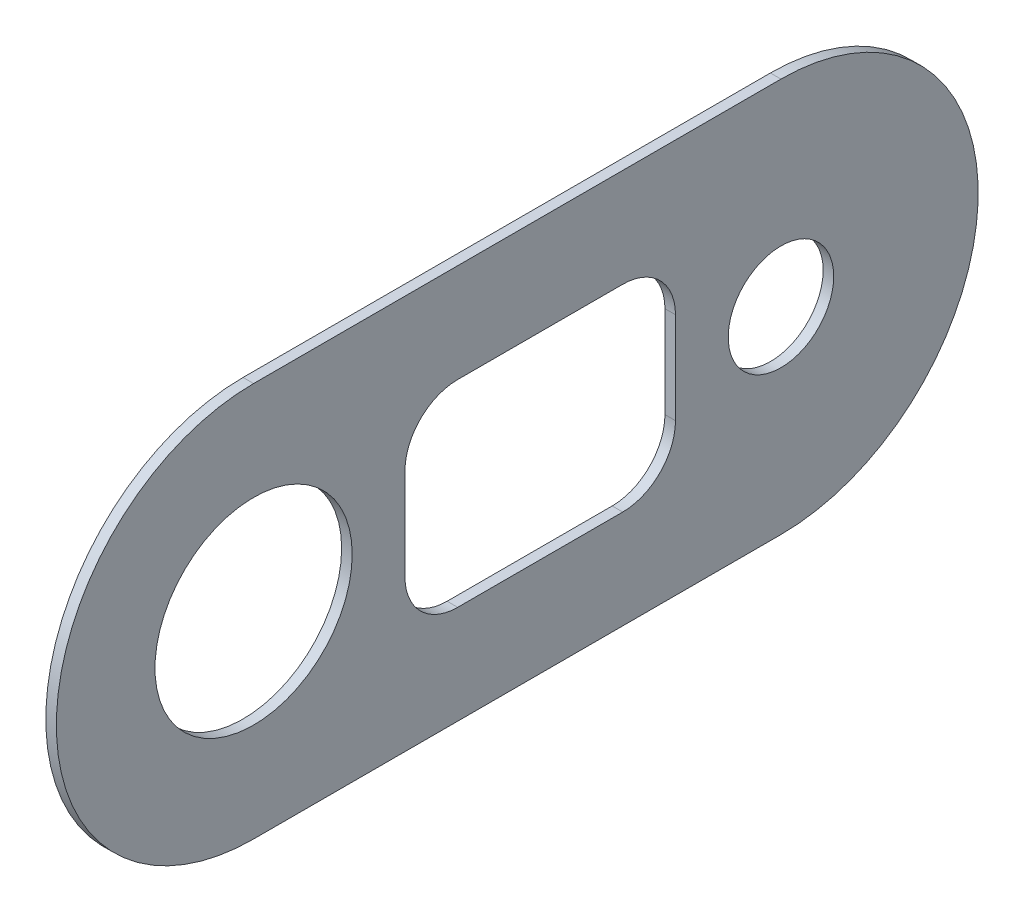
ISO-10303-21;
HEADER;
FILE_DESCRIPTION(('STEP AP214'),'2;1');
FILE_NAME('part.step','',(''),(''),'','','');
FILE_SCHEMA(('AUTOMOTIVE_DESIGN { 1 0 10303 214 1 1 1 1 }'));
ENDSEC;
DATA;
#1=APPLICATION_CONTEXT('core data for automotive mechanical design processes');
#2=APPLICATION_PROTOCOL_DEFINITION('international standard','automotive_design',2000,#1);
#3=PRODUCT_CONTEXT('',#1,'mechanical');
#4=PRODUCT('Part','Part','',(#3));
#5=PRODUCT_RELATED_PRODUCT_CATEGORY('part','',(#4));
#6=PRODUCT_DEFINITION_FORMATION('','',#4);
#7=PRODUCT_DEFINITION_CONTEXT('part definition',#1,'design');
#8=PRODUCT_DEFINITION('design','',#6,#7);
#9=PRODUCT_DEFINITION_SHAPE('','',#8);
#10=(LENGTH_UNIT() NAMED_UNIT(*) SI_UNIT(.MILLI.,.METRE.));
#11=(NAMED_UNIT(*) PLANE_ANGLE_UNIT() SI_UNIT($,.RADIAN.));
#12=(NAMED_UNIT(*) SI_UNIT($,.STERADIAN.) SOLID_ANGLE_UNIT());
#13=UNCERTAINTY_MEASURE_WITH_UNIT(LENGTH_MEASURE(1.E-05),#10,'distance_accuracy_value','');
#14=(GEOMETRIC_REPRESENTATION_CONTEXT(3) GLOBAL_UNCERTAINTY_ASSIGNED_CONTEXT((#13)) GLOBAL_UNIT_ASSIGNED_CONTEXT((#10,
#11,#12)) REPRESENTATION_CONTEXT('',''));
#15=CARTESIAN_POINT('',(0.,0.,0.));
#16=DIRECTION('',(0.,0.,1.));
#17=DIRECTION('',(1.,0.,0.));
#18=AXIS2_PLACEMENT_3D('',#15,#16,#17);
#19=CARTESIAN_POINT('',(2.54,47.498,0.));
#20=DIRECTION('',(1.,0.,0.));
#21=DIRECTION('',(0.,0.,-1.));
#22=AXIS2_PLACEMENT_3D('',#19,#20,#21);
#23=PLANE('',#22);
#24=CARTESIAN_POINT('',(2.54,47.498,0.));
#25=DIRECTION('',(1.,0.,0.));
#26=DIRECTION('',(0.,0.,-1.));
#27=AXIS2_PLACEMENT_3D('',#24,#25,#26);
#28=CIRCLE('',#27,12.7);
#29=CARTESIAN_POINT('',(2.54,47.498,-12.7));
#30=VERTEX_POINT('',#29);
#31=EDGE_CURVE('E202',#30,#30,#28,.T.);
#32=ORIENTED_EDGE('',*,*,#31,.F.);
#33=EDGE_LOOP('',(#32));
#34=FACE_BOUND('',#33,.T.);
#35=CARTESIAN_POINT('',(2.54,47.498,0.));
#36=DIRECTION('',(1.,0.,0.));
#37=DIRECTION('',(0.,0.,-1.));
#38=AXIS2_PLACEMENT_3D('',#35,#36,#37);
#39=CIRCLE('',#38,47.498);
#40=CARTESIAN_POINT('',(2.54,0.,0.));
#41=VERTEX_POINT('',#40);
#42=CARTESIAN_POINT('',(2.54,94.996,0.));
#43=VERTEX_POINT('',#42);
#44=EDGE_CURVE('E211',#41,#43,#39,.T.);
#45=ORIENTED_EDGE('',*,*,#44,.T.);
#46=DIRECTION('',(0.,0.,1.));
#47=VECTOR('',#46,1.);
#48=CARTESIAN_POINT('',(2.54,94.996,0.));
#49=LINE('',#48,#47);
#50=CARTESIAN_POINT('',(2.54,94.996,127.));
#51=VERTEX_POINT('',#50);
#52=EDGE_CURVE('E212',#43,#51,#49,.T.);
#53=ORIENTED_EDGE('',*,*,#52,.T.);
#54=CARTESIAN_POINT('',(2.54,47.498,127.));
#55=DIRECTION('',(1.,0.,0.));
#56=DIRECTION('',(0.,0.,1.));
#57=AXIS2_PLACEMENT_3D('',#54,#55,#56);
#58=CIRCLE('',#57,47.498);
#59=CARTESIAN_POINT('',(2.54,0.,127.));
#60=VERTEX_POINT('',#59);
#61=EDGE_CURVE('E220',#51,#60,#58,.T.);
#62=ORIENTED_EDGE('',*,*,#61,.T.);
#63=DIRECTION('',(0.,0.,-1.));
#64=VECTOR('',#63,1.);
#65=CARTESIAN_POINT('',(2.54,0.,0.));
#66=LINE('',#65,#64);
#67=EDGE_CURVE('E218',#60,#41,#66,.T.);
#68=ORIENTED_EDGE('',*,*,#67,.T.);
#69=EDGE_LOOP('',(#45,#53,#62,#68));
#70=FACE_BOUND('',#69,.T.);
#71=CARTESIAN_POINT('',(2.54,47.498,127.));
#72=DIRECTION('',(1.,0.,0.));
#73=DIRECTION('',(0.,0.,-1.));
#74=AXIS2_PLACEMENT_3D('',#71,#72,#73);
#75=CIRCLE('',#74,23.749);
#76=CARTESIAN_POINT('',(2.54,47.498,103.251));
#77=VERTEX_POINT('',#76);
#78=EDGE_CURVE('E200',#77,#77,#75,.T.);
#79=ORIENTED_EDGE('',*,*,#78,.F.);
#80=EDGE_LOOP('',(#79));
#81=FACE_BOUND('',#80,.T.);
#82=DIRECTION('',(0.,-1.,0.));
#83=VECTOR('',#82,1.);
#84=CARTESIAN_POINT('',(2.54,36.449,90.551));
#85=LINE('',#84,#83);
#86=CARTESIAN_POINT('',(2.54,58.547,90.551));
#87=VERTEX_POINT('',#86);
#88=CARTESIAN_POINT('',(2.54,36.449,90.551));
#89=VERTEX_POINT('',#88);
#90=EDGE_CURVE('E142',#87,#89,#85,.T.);
#91=ORIENTED_EDGE('',*,*,#90,.F.);
#92=CARTESIAN_POINT('',(2.54,58.547,77.851));
#93=DIRECTION('',(1.,0.,0.));
#94=DIRECTION('',(0.,0.,1.));
#95=AXIS2_PLACEMENT_3D('',#92,#93,#94);
#96=CIRCLE('',#95,12.7);
#97=CARTESIAN_POINT('',(2.54,71.247,77.851));
#98=VERTEX_POINT('',#97);
#99=EDGE_CURVE('E133',#98,#87,#96,.T.);
#100=ORIENTED_EDGE('',*,*,#99,.F.);
#101=DIRECTION('',(0.,0.,1.));
#102=VECTOR('',#101,1.);
#103=CARTESIAN_POINT('',(2.54,71.247,77.851));
#104=LINE('',#103,#102);
#105=CARTESIAN_POINT('',(2.54,71.247,38.1));
#106=VERTEX_POINT('',#105);
#107=EDGE_CURVE('E170',#106,#98,#104,.T.);
#108=ORIENTED_EDGE('',*,*,#107,.F.);
#109=CARTESIAN_POINT('',(2.54,58.547,38.1));
#110=DIRECTION('',(1.,0.,0.));
#111=DIRECTION('',(0.,0.,1.));
#112=AXIS2_PLACEMENT_3D('',#109,#110,#111);
#113=CIRCLE('',#112,12.7);
#114=CARTESIAN_POINT('',(2.54,58.547,25.4));
#115=VERTEX_POINT('',#114);
#116=EDGE_CURVE('E164',#115,#106,#113,.T.);
#117=ORIENTED_EDGE('',*,*,#116,.F.);
#118=DIRECTION('',(0.,1.,0.));
#119=VECTOR('',#118,1.);
#120=CARTESIAN_POINT('',(2.54,58.547,25.4));
#121=LINE('',#120,#119);
#122=CARTESIAN_POINT('',(2.54,36.449,25.4));
#123=VERTEX_POINT('',#122);
#124=EDGE_CURVE('E162',#123,#115,#121,.T.);
#125=ORIENTED_EDGE('',*,*,#124,.F.);
#126=CARTESIAN_POINT('',(2.54,36.449,38.1));
#127=DIRECTION('',(1.,0.,0.));
#128=DIRECTION('',(0.,0.,1.));
#129=AXIS2_PLACEMENT_3D('',#126,#127,#128);
#130=CIRCLE('',#129,12.7);
#131=CARTESIAN_POINT('',(2.54,23.749,38.1));
#132=VERTEX_POINT('',#131);
#133=EDGE_CURVE('E161',#132,#123,#130,.T.);
#134=ORIENTED_EDGE('',*,*,#133,.F.);
#135=DIRECTION('',(0.,0.,-1.));
#136=VECTOR('',#135,1.);
#137=CARTESIAN_POINT('',(2.54,23.749,38.1));
#138=LINE('',#137,#136);
#139=CARTESIAN_POINT('',(2.54,23.749,77.851));
#140=VERTEX_POINT('',#139);
#141=EDGE_CURVE('E160',#140,#132,#138,.T.);
#142=ORIENTED_EDGE('',*,*,#141,.F.);
#143=CARTESIAN_POINT('',(2.54,36.449,77.851));
#144=DIRECTION('',(1.,0.,0.));
#145=DIRECTION('',(0.,0.,-1.));
#146=AXIS2_PLACEMENT_3D('',#143,#144,#145);
#147=CIRCLE('',#146,12.7);
#148=EDGE_CURVE('E154',#89,#140,#147,.T.);
#149=ORIENTED_EDGE('',*,*,#148,.F.);
#150=EDGE_LOOP('',(#91,#100,#108,#117,#125,#134,#142,#149));
#151=FACE_BOUND('',#150,.T.);
#152=ADVANCED_FACE('F44',(#34,#70,#81,#151),#23,.T.);
#153=CARTESIAN_POINT('',(0.,47.498,0.));
#154=DIRECTION('',(1.,0.,0.));
#155=DIRECTION('',(0.,0.,-1.));
#156=AXIS2_PLACEMENT_3D('',#153,#154,#155);
#157=PLANE('',#156);
#158=CARTESIAN_POINT('',(0.,47.498,127.));
#159=DIRECTION('',(1.,0.,0.));
#160=DIRECTION('',(0.,0.,-1.));
#161=AXIS2_PLACEMENT_3D('',#158,#159,#160);
#162=CIRCLE('',#161,23.749);
#163=CARTESIAN_POINT('',(0.,47.498,103.251));
#164=VERTEX_POINT('',#163);
#165=EDGE_CURVE('E147',#164,#164,#162,.T.);
#166=ORIENTED_EDGE('',*,*,#165,.T.);
#167=EDGE_LOOP('',(#166));
#168=FACE_BOUND('',#167,.T.);
#169=CARTESIAN_POINT('',(0.,47.498,0.));
#170=DIRECTION('',(1.,0.,0.));
#171=DIRECTION('',(0.,0.,-1.));
#172=AXIS2_PLACEMENT_3D('',#169,#170,#171);
#173=CIRCLE('',#172,12.7);
#174=CARTESIAN_POINT('',(0.,47.498,-12.7));
#175=VERTEX_POINT('',#174);
#176=EDGE_CURVE('E205',#175,#175,#173,.T.);
#177=ORIENTED_EDGE('',*,*,#176,.T.);
#178=EDGE_LOOP('',(#177));
#179=FACE_BOUND('',#178,.T.);
#180=CARTESIAN_POINT('',(0.,47.498,0.));
#181=DIRECTION('',(1.,0.,0.));
#182=DIRECTION('',(0.,0.,-1.));
#183=AXIS2_PLACEMENT_3D('',#180,#181,#182);
#184=CIRCLE('',#183,47.498);
#185=CARTESIAN_POINT('',(0.,0.,0.));
#186=VERTEX_POINT('',#185);
#187=CARTESIAN_POINT('',(0.,94.996,0.));
#188=VERTEX_POINT('',#187);
#189=EDGE_CURVE('E208',#186,#188,#184,.T.);
#190=ORIENTED_EDGE('',*,*,#189,.F.);
#191=DIRECTION('',(0.,0.,-1.));
#192=VECTOR('',#191,1.);
#193=CARTESIAN_POINT('',(0.,0.,0.));
#194=LINE('',#193,#192);
#195=CARTESIAN_POINT('',(0.,0.,127.));
#196=VERTEX_POINT('',#195);
#197=EDGE_CURVE('E214',#196,#186,#194,.T.);
#198=ORIENTED_EDGE('',*,*,#197,.F.);
#199=CARTESIAN_POINT('',(0.,47.498,127.));
#200=DIRECTION('',(1.,0.,0.));
#201=DIRECTION('',(0.,0.,1.));
#202=AXIS2_PLACEMENT_3D('',#199,#200,#201);
#203=CIRCLE('',#202,47.498);
#204=CARTESIAN_POINT('',(0.,94.996,127.));
#205=VERTEX_POINT('',#204);
#206=EDGE_CURVE('E229',#205,#196,#203,.T.);
#207=ORIENTED_EDGE('',*,*,#206,.F.);
#208=DIRECTION('',(0.,0.,1.));
#209=VECTOR('',#208,1.);
#210=CARTESIAN_POINT('',(0.,94.996,0.));
#211=LINE('',#210,#209);
#212=EDGE_CURVE('E221',#188,#205,#211,.T.);
#213=ORIENTED_EDGE('',*,*,#212,.F.);
#214=EDGE_LOOP('',(#190,#198,#207,#213));
#215=FACE_BOUND('',#214,.T.);
#216=CARTESIAN_POINT('',(0.,58.547,77.851));
#217=DIRECTION('',(1.,0.,0.));
#218=DIRECTION('',(0.,0.,1.));
#219=AXIS2_PLACEMENT_3D('',#216,#217,#218);
#220=CIRCLE('',#219,12.7);
#221=CARTESIAN_POINT('',(0.,71.247,77.851));
#222=VERTEX_POINT('',#221);
#223=CARTESIAN_POINT('',(0.,58.547,90.551));
#224=VERTEX_POINT('',#223);
#225=EDGE_CURVE('E68',#222,#224,#220,.T.);
#226=ORIENTED_EDGE('',*,*,#225,.T.);
#227=DIRECTION('',(0.,-1.,0.));
#228=VECTOR('',#227,1.);
#229=CARTESIAN_POINT('',(0.,36.449,90.551));
#230=LINE('',#229,#228);
#231=CARTESIAN_POINT('',(0.,36.449,90.551));
#232=VERTEX_POINT('',#231);
#233=EDGE_CURVE('E149',#224,#232,#230,.T.);
#234=ORIENTED_EDGE('',*,*,#233,.T.);
#235=CARTESIAN_POINT('',(0.,36.449,77.851));
#236=DIRECTION('',(1.,0.,0.));
#237=DIRECTION('',(0.,0.,-1.));
#238=AXIS2_PLACEMENT_3D('',#235,#236,#237);
#239=CIRCLE('',#238,12.7);
#240=CARTESIAN_POINT('',(0.,23.749,77.851));
#241=VERTEX_POINT('',#240);
#242=EDGE_CURVE('E174',#232,#241,#239,.T.);
#243=ORIENTED_EDGE('',*,*,#242,.T.);
#244=DIRECTION('',(0.,0.,-1.));
#245=VECTOR('',#244,1.);
#246=CARTESIAN_POINT('',(0.,23.749,38.1));
#247=LINE('',#246,#245);
#248=CARTESIAN_POINT('',(0.,23.749,38.1));
#249=VERTEX_POINT('',#248);
#250=EDGE_CURVE('E173',#241,#249,#247,.T.);
#251=ORIENTED_EDGE('',*,*,#250,.T.);
#252=CARTESIAN_POINT('',(0.,36.449,38.1));
#253=DIRECTION('',(1.,0.,0.));
#254=DIRECTION('',(0.,0.,1.));
#255=AXIS2_PLACEMENT_3D('',#252,#253,#254);
#256=CIRCLE('',#255,12.7);
#257=CARTESIAN_POINT('',(0.,36.449,25.4));
#258=VERTEX_POINT('',#257);
#259=EDGE_CURVE('E180',#249,#258,#256,.T.);
#260=ORIENTED_EDGE('',*,*,#259,.T.);
#261=DIRECTION('',(0.,1.,0.));
#262=VECTOR('',#261,1.);
#263=CARTESIAN_POINT('',(0.,58.547,25.4));
#264=LINE('',#263,#262);
#265=CARTESIAN_POINT('',(0.,58.547,25.4));
#266=VERTEX_POINT('',#265);
#267=EDGE_CURVE('E179',#258,#266,#264,.T.);
#268=ORIENTED_EDGE('',*,*,#267,.T.);
#269=CARTESIAN_POINT('',(0.,58.547,38.1));
#270=DIRECTION('',(1.,0.,0.));
#271=DIRECTION('',(0.,0.,1.));
#272=AXIS2_PLACEMENT_3D('',#269,#270,#271);
#273=CIRCLE('',#272,12.7);
#274=CARTESIAN_POINT('',(0.,71.247,38.1));
#275=VERTEX_POINT('',#274);
#276=EDGE_CURVE('E181',#266,#275,#273,.T.);
#277=ORIENTED_EDGE('',*,*,#276,.T.);
#278=DIRECTION('',(0.,0.,1.));
#279=VECTOR('',#278,1.);
#280=CARTESIAN_POINT('',(0.,71.247,77.851));
#281=LINE('',#280,#279);
#282=EDGE_CURVE('E141',#275,#222,#281,.T.);
#283=ORIENTED_EDGE('',*,*,#282,.T.);
#284=EDGE_LOOP('',(#226,#234,#243,#251,#260,#268,#277,#283));
#285=FACE_BOUND('',#284,.T.);
#286=ADVANCED_FACE('F243',(#168,#179,#215,#285),#157,.F.);
#287=CARTESIAN_POINT('',(2.54,47.498,0.));
#288=DIRECTION('',(-1.,0.,0.));
#289=DIRECTION('',(0.,0.,1.));
#290=AXIS2_PLACEMENT_3D('',#287,#288,#289);
#291=CYLINDRICAL_SURFACE('',#290,47.498);
#292=ORIENTED_EDGE('',*,*,#189,.T.);
#293=DIRECTION('',(-1.,0.,0.));
#294=VECTOR('',#293,1.);
#295=CARTESIAN_POINT('',(2.54,94.996,0.));
#296=LINE('',#295,#294);
#297=EDGE_CURVE('E11',#43,#188,#296,.T.);
#298=ORIENTED_EDGE('',*,*,#297,.F.);
#299=ORIENTED_EDGE('',*,*,#44,.F.);
#300=DIRECTION('',(-1.,0.,0.));
#301=VECTOR('',#300,1.);
#302=CARTESIAN_POINT('',(2.54,0.,0.));
#303=LINE('',#302,#301);
#304=EDGE_CURVE('E222',#41,#186,#303,.T.);
#305=ORIENTED_EDGE('',*,*,#304,.T.);
#306=EDGE_LOOP('',(#292,#298,#299,#305));
#307=FACE_BOUND('',#306,.T.);
#308=ADVANCED_FACE('F50',(#307),#291,.T.);
#309=CARTESIAN_POINT('',(2.54,94.996,0.));
#310=DIRECTION('',(0.,-1.,0.));
#311=DIRECTION('',(0.,0.,-1.));
#312=AXIS2_PLACEMENT_3D('',#309,#310,#311);
#313=PLANE('',#312);
#314=ORIENTED_EDGE('',*,*,#212,.T.);
#315=DIRECTION('',(-1.,0.,0.));
#316=VECTOR('',#315,1.);
#317=CARTESIAN_POINT('',(2.54,94.996,127.));
#318=LINE('',#317,#316);
#319=EDGE_CURVE('E52',#51,#205,#318,.T.);
#320=ORIENTED_EDGE('',*,*,#319,.F.);
#321=ORIENTED_EDGE('',*,*,#52,.F.);
#322=ORIENTED_EDGE('',*,*,#297,.T.);
#323=EDGE_LOOP('',(#314,#320,#321,#322));
#324=FACE_BOUND('',#323,.T.);
#325=ADVANCED_FACE('F254',(#324),#313,.F.);
#326=CARTESIAN_POINT('',(2.54,47.498,127.));
#327=DIRECTION('',(-1.,0.,0.));
#328=DIRECTION('',(0.,0.,1.));
#329=AXIS2_PLACEMENT_3D('',#326,#327,#328);
#330=CYLINDRICAL_SURFACE('',#329,47.498);
#331=ORIENTED_EDGE('',*,*,#206,.T.);
#332=DIRECTION('',(-1.,0.,0.));
#333=VECTOR('',#332,1.);
#334=CARTESIAN_POINT('',(2.54,0.,127.));
#335=LINE('',#334,#333);
#336=EDGE_CURVE('E231',#60,#196,#335,.T.);
#337=ORIENTED_EDGE('',*,*,#336,.F.);
#338=ORIENTED_EDGE('',*,*,#61,.F.);
#339=ORIENTED_EDGE('',*,*,#319,.T.);
#340=EDGE_LOOP('',(#331,#337,#338,#339));
#341=FACE_BOUND('',#340,.T.);
#342=ADVANCED_FACE('F236',(#341),#330,.T.);
#343=CARTESIAN_POINT('',(2.54,0.,0.));
#344=DIRECTION('',(0.,1.,0.));
#345=DIRECTION('',(0.,0.,1.));
#346=AXIS2_PLACEMENT_3D('',#343,#344,#345);
#347=PLANE('',#346);
#348=ORIENTED_EDGE('',*,*,#197,.T.);
#349=ORIENTED_EDGE('',*,*,#304,.F.);
#350=ORIENTED_EDGE('',*,*,#67,.F.);
#351=ORIENTED_EDGE('',*,*,#336,.T.);
#352=EDGE_LOOP('',(#348,#349,#350,#351));
#353=FACE_BOUND('',#352,.T.);
#354=ADVANCED_FACE('F248',(#353),#347,.F.);
#355=CARTESIAN_POINT('',(2.54,47.498,0.));
#356=DIRECTION('',(-1.,0.,0.));
#357=DIRECTION('',(0.,0.,1.));
#358=AXIS2_PLACEMENT_3D('',#355,#356,#357);
#359=CYLINDRICAL_SURFACE('',#358,12.7);
#360=ORIENTED_EDGE('',*,*,#31,.T.);
#361=EDGE_LOOP('',(#360));
#362=FACE_BOUND('',#361,.T.);
#363=ORIENTED_EDGE('',*,*,#176,.F.);
#364=EDGE_LOOP('',(#363));
#365=FACE_BOUND('',#364,.T.);
#366=ADVANCED_FACE('F275',(#362,#365),#359,.F.);
#367=CARTESIAN_POINT('',(2.54,47.498,127.));
#368=DIRECTION('',(-1.,0.,0.));
#369=DIRECTION('',(0.,0.,1.));
#370=AXIS2_PLACEMENT_3D('',#367,#368,#369);
#371=CYLINDRICAL_SURFACE('',#370,23.749);
#372=ORIENTED_EDGE('',*,*,#78,.T.);
#373=EDGE_LOOP('',(#372));
#374=FACE_BOUND('',#373,.T.);
#375=ORIENTED_EDGE('',*,*,#165,.F.);
#376=EDGE_LOOP('',(#375));
#377=FACE_BOUND('',#376,.T.);
#378=ADVANCED_FACE('F276',(#374,#377),#371,.F.);
#379=CARTESIAN_POINT('',(2.54,58.547,77.851));
#380=DIRECTION('',(-1.,0.,0.));
#381=DIRECTION('',(0.,0.,1.));
#382=AXIS2_PLACEMENT_3D('',#379,#380,#381);
#383=CYLINDRICAL_SURFACE('',#382,12.7);
#384=ORIENTED_EDGE('',*,*,#225,.F.);
#385=DIRECTION('',(-1.,0.,0.));
#386=VECTOR('',#385,1.);
#387=CARTESIAN_POINT('',(2.54,71.247,77.851));
#388=LINE('',#387,#386);
#389=EDGE_CURVE('E138',#98,#222,#388,.T.);
#390=ORIENTED_EDGE('',*,*,#389,.F.);
#391=ORIENTED_EDGE('',*,*,#99,.T.);
#392=DIRECTION('',(-1.,0.,0.));
#393=VECTOR('',#392,1.);
#394=CARTESIAN_POINT('',(2.54,58.547,90.551));
#395=LINE('',#394,#393);
#396=EDGE_CURVE('E140',#87,#224,#395,.T.);
#397=ORIENTED_EDGE('',*,*,#396,.T.);
#398=EDGE_LOOP('',(#384,#390,#391,#397));
#399=FACE_BOUND('',#398,.T.);
#400=ADVANCED_FACE('F136',(#399),#383,.F.);
#401=CARTESIAN_POINT('',(2.54,36.449,90.551));
#402=DIRECTION('',(0.,0.,-1.));
#403=DIRECTION('',(-1.,0.,0.));
#404=AXIS2_PLACEMENT_3D('',#401,#402,#403);
#405=PLANE('',#404);
#406=ORIENTED_EDGE('',*,*,#233,.F.);
#407=ORIENTED_EDGE('',*,*,#396,.F.);
#408=ORIENTED_EDGE('',*,*,#90,.T.);
#409=DIRECTION('',(-1.,0.,0.));
#410=VECTOR('',#409,1.);
#411=CARTESIAN_POINT('',(2.54,36.449,90.551));
#412=LINE('',#411,#410);
#413=EDGE_CURVE('E151',#89,#232,#412,.T.);
#414=ORIENTED_EDGE('',*,*,#413,.T.);
#415=EDGE_LOOP('',(#406,#407,#408,#414));
#416=FACE_BOUND('',#415,.T.);
#417=ADVANCED_FACE('F148',(#416),#405,.T.);
#418=CARTESIAN_POINT('',(2.54,36.449,77.851));
#419=DIRECTION('',(-1.,0.,0.));
#420=DIRECTION('',(0.,0.,1.));
#421=AXIS2_PLACEMENT_3D('',#418,#419,#420);
#422=CYLINDRICAL_SURFACE('',#421,12.7);
#423=ORIENTED_EDGE('',*,*,#242,.F.);
#424=ORIENTED_EDGE('',*,*,#413,.F.);
#425=ORIENTED_EDGE('',*,*,#148,.T.);
#426=DIRECTION('',(-1.,0.,0.));
#427=VECTOR('',#426,1.);
#428=CARTESIAN_POINT('',(2.54,23.749,77.851));
#429=LINE('',#428,#427);
#430=EDGE_CURVE('E198',#140,#241,#429,.T.);
#431=ORIENTED_EDGE('',*,*,#430,.T.);
#432=EDGE_LOOP('',(#423,#424,#425,#431));
#433=FACE_BOUND('',#432,.T.);
#434=ADVANCED_FACE('F299',(#433),#422,.F.);
#435=CARTESIAN_POINT('',(2.54,23.749,38.1));
#436=DIRECTION('',(0.,1.,0.));
#437=DIRECTION('',(0.,0.,1.));
#438=AXIS2_PLACEMENT_3D('',#435,#436,#437);
#439=PLANE('',#438);
#440=ORIENTED_EDGE('',*,*,#250,.F.);
#441=ORIENTED_EDGE('',*,*,#430,.F.);
#442=ORIENTED_EDGE('',*,*,#141,.T.);
#443=DIRECTION('',(-1.,0.,0.));
#444=VECTOR('',#443,1.);
#445=CARTESIAN_POINT('',(2.54,23.749,38.1));
#446=LINE('',#445,#444);
#447=EDGE_CURVE('E192',#132,#249,#446,.T.);
#448=ORIENTED_EDGE('',*,*,#447,.T.);
#449=EDGE_LOOP('',(#440,#441,#442,#448));
#450=FACE_BOUND('',#449,.T.);
#451=ADVANCED_FACE('F298',(#450),#439,.T.);
#452=CARTESIAN_POINT('',(2.54,36.449,38.1));
#453=DIRECTION('',(-1.,0.,0.));
#454=DIRECTION('',(0.,0.,1.));
#455=AXIS2_PLACEMENT_3D('',#452,#453,#454);
#456=CYLINDRICAL_SURFACE('',#455,12.7);
#457=ORIENTED_EDGE('',*,*,#259,.F.);
#458=ORIENTED_EDGE('',*,*,#447,.F.);
#459=ORIENTED_EDGE('',*,*,#133,.T.);
#460=DIRECTION('',(-1.,0.,0.));
#461=VECTOR('',#460,1.);
#462=CARTESIAN_POINT('',(2.54,36.449,25.4));
#463=LINE('',#462,#461);
#464=EDGE_CURVE('E195',#123,#258,#463,.T.);
#465=ORIENTED_EDGE('',*,*,#464,.T.);
#466=EDGE_LOOP('',(#457,#458,#459,#465));
#467=FACE_BOUND('',#466,.T.);
#468=ADVANCED_FACE('F303',(#467),#456,.F.);
#469=CARTESIAN_POINT('',(2.54,58.547,25.4));
#470=DIRECTION('',(0.,0.,1.));
#471=DIRECTION('',(0.,-1.,0.));
#472=AXIS2_PLACEMENT_3D('',#469,#470,#471);
#473=PLANE('',#472);
#474=ORIENTED_EDGE('',*,*,#267,.F.);
#475=ORIENTED_EDGE('',*,*,#464,.F.);
#476=ORIENTED_EDGE('',*,*,#124,.T.);
#477=DIRECTION('',(-1.,0.,0.));
#478=VECTOR('',#477,1.);
#479=CARTESIAN_POINT('',(2.54,58.547,25.4));
#480=LINE('',#479,#478);
#481=EDGE_CURVE('E187',#115,#266,#480,.T.);
#482=ORIENTED_EDGE('',*,*,#481,.T.);
#483=EDGE_LOOP('',(#474,#475,#476,#482));
#484=FACE_BOUND('',#483,.T.);
#485=ADVANCED_FACE('F307',(#484),#473,.T.);
#486=CARTESIAN_POINT('',(2.54,58.547,38.1));
#487=DIRECTION('',(-1.,0.,0.));
#488=DIRECTION('',(0.,0.,1.));
#489=AXIS2_PLACEMENT_3D('',#486,#487,#488);
#490=CYLINDRICAL_SURFACE('',#489,12.7);
#491=ORIENTED_EDGE('',*,*,#276,.F.);
#492=ORIENTED_EDGE('',*,*,#481,.F.);
#493=ORIENTED_EDGE('',*,*,#116,.T.);
#494=DIRECTION('',(-1.,0.,0.));
#495=VECTOR('',#494,1.);
#496=CARTESIAN_POINT('',(2.54,71.247,38.1));
#497=LINE('',#496,#495);
#498=EDGE_CURVE('E58',#106,#275,#497,.T.);
#499=ORIENTED_EDGE('',*,*,#498,.T.);
#500=EDGE_LOOP('',(#491,#492,#493,#499));
#501=FACE_BOUND('',#500,.T.);
#502=ADVANCED_FACE('F313',(#501),#490,.F.);
#503=CARTESIAN_POINT('',(2.54,71.247,77.851));
#504=DIRECTION('',(0.,-1.,0.));
#505=DIRECTION('',(0.,0.,-1.));
#506=AXIS2_PLACEMENT_3D('',#503,#504,#505);
#507=PLANE('',#506);
#508=ORIENTED_EDGE('',*,*,#282,.F.);
#509=ORIENTED_EDGE('',*,*,#498,.F.);
#510=ORIENTED_EDGE('',*,*,#107,.T.);
#511=ORIENTED_EDGE('',*,*,#389,.T.);
#512=EDGE_LOOP('',(#508,#509,#510,#511));
#513=FACE_BOUND('',#512,.T.);
#514=ADVANCED_FACE('F312',(#513),#507,.T.);
#515=CLOSED_SHELL('',(#152,#286,#308,#325,#342,#354,#366,#378,#400,#417,#434,#451,#468,#485,
#502,#514));
#516=MANIFOLD_SOLID_BREP('B2',#515);
#517=ADVANCED_BREP_SHAPE_REPRESENTATION('',(#18,#516),#14);
#518=SHAPE_DEFINITION_REPRESENTATION(#9,#517);
ENDSEC;
END-ISO-10303-21;
